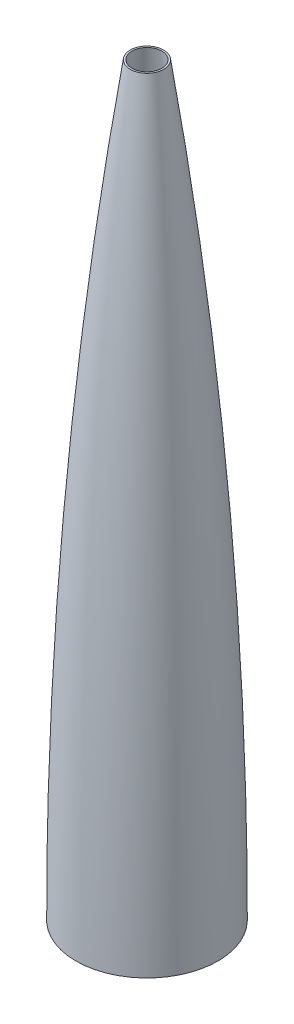
ISO-10303-21;
HEADER;
FILE_DESCRIPTION(('STEP AP214'),'2;1');
FILE_NAME('part.step','',(''),(''),'','','');
FILE_SCHEMA(('AUTOMOTIVE_DESIGN { 1 0 10303 214 1 1 1 1 }'));
ENDSEC;
DATA;
#1=APPLICATION_CONTEXT('core data for automotive mechanical design processes');
#2=APPLICATION_PROTOCOL_DEFINITION('international standard','automotive_design',2000,#1);
#3=PRODUCT_CONTEXT('',#1,'mechanical');
#4=PRODUCT('Part','Part','',(#3));
#5=PRODUCT_RELATED_PRODUCT_CATEGORY('part','',(#4));
#6=PRODUCT_DEFINITION_FORMATION('','',#4);
#7=PRODUCT_DEFINITION_CONTEXT('part definition',#1,'design');
#8=PRODUCT_DEFINITION('design','',#6,#7);
#9=PRODUCT_DEFINITION_SHAPE('','',#8);
#10=(LENGTH_UNIT() NAMED_UNIT(*) SI_UNIT(.MILLI.,.METRE.));
#11=(NAMED_UNIT(*) PLANE_ANGLE_UNIT() SI_UNIT($,.RADIAN.));
#12=(NAMED_UNIT(*) SI_UNIT($,.STERADIAN.) SOLID_ANGLE_UNIT());
#13=UNCERTAINTY_MEASURE_WITH_UNIT(LENGTH_MEASURE(1.E-05),#10,'distance_accuracy_value','');
#14=(GEOMETRIC_REPRESENTATION_CONTEXT(3) GLOBAL_UNCERTAINTY_ASSIGNED_CONTEXT((#13)) GLOBAL_UNIT_ASSIGNED_CONTEXT((#10,
#11,#12)) REPRESENTATION_CONTEXT('',''));
#15=CARTESIAN_POINT('',(0.,0.,0.));
#16=DIRECTION('',(0.,0.,1.));
#17=DIRECTION('',(1.,0.,0.));
#18=AXIS2_PLACEMENT_3D('',#15,#16,#17);
#19=CARTESIAN_POINT('',(0.,0.,0.));
#20=DIRECTION('',(0.,1.,0.));
#21=DIRECTION('',(0.,0.,1.));
#22=AXIS2_PLACEMENT_3D('',#19,#20,#21);
#23=DEGENERATE_TOROIDAL_SURFACE('',#22,3632.19999999999,3681.72999999999,.F.);
#24=CARTESIAN_POINT('',(0.,533.4,0.));
#25=DIRECTION('',(0.,1.,0.));
#26=DIRECTION('',(0.,0.,1.));
#27=AXIS2_PLACEMENT_3D('',#24,#25,#26);
#28=CIRCLE('',#27,10.6862503377726);
#29=CARTESIAN_POINT('',(0.,533.4,10.6862503377726));
#30=VERTEX_POINT('',#29);
#31=EDGE_CURVE('E10',#30,#30,#28,.T.);
#32=ORIENTED_EDGE('',*,*,#31,.T.);
#33=EDGE_LOOP('',(#32));
#34=FACE_BOUND('',#33,.T.);
#35=CARTESIAN_POINT('',(0.,0.,0.));
#36=DIRECTION('',(0.,1.,0.));
#37=DIRECTION('',(0.,0.,1.));
#38=AXIS2_PLACEMENT_3D('',#35,#36,#37);
#39=CIRCLE('',#38,49.53);
#40=CARTESIAN_POINT('',(0.,0.,49.53));
#41=VERTEX_POINT('',#40);
#42=EDGE_CURVE('E45',#41,#41,#39,.T.);
#43=ORIENTED_EDGE('',*,*,#42,.F.);
#44=EDGE_LOOP('',(#43));
#45=FACE_BOUND('',#44,.T.);
#46=ADVANCED_FACE('F31',(#34,#45),#23,.T.);
#47=CARTESIAN_POINT('',(-10.6862503377726,533.4,0.));
#48=DIRECTION('',(0.,1.,0.));
#49=DIRECTION('',(0.,0.,1.));
#50=AXIS2_PLACEMENT_3D('',#47,#48,#49);
#51=PLANE('',#50);
#52=CARTESIAN_POINT('',(0.,533.4,0.));
#53=DIRECTION('',(0.,1.,0.));
#54=DIRECTION('',(0.,0.,1.));
#55=AXIS2_PLACEMENT_3D('',#52,#53,#54);
#56=CIRCLE('',#55,11.9697874824656);
#57=CARTESIAN_POINT('',(0.,533.4,11.9697874824656));
#58=VERTEX_POINT('',#57);
#59=EDGE_CURVE('E37',#58,#58,#56,.T.);
#60=ORIENTED_EDGE('',*,*,#59,.T.);
#61=EDGE_LOOP('',(#60));
#62=FACE_BOUND('',#61,.T.);
#63=ORIENTED_EDGE('',*,*,#31,.F.);
#64=EDGE_LOOP('',(#63));
#65=FACE_BOUND('',#64,.T.);
#66=ADVANCED_FACE('F55',(#62,#65),#51,.T.);
#67=CARTESIAN_POINT('',(0.,0.,0.));
#68=DIRECTION('',(0.,1.,0.));
#69=DIRECTION('',(0.,0.,1.));
#70=AXIS2_PLACEMENT_3D('',#67,#68,#69);
#71=DEGENERATE_TOROIDAL_SURFACE('',#70,3632.19999999999,3682.99999999999,.F.);
#72=CARTESIAN_POINT('',(0.,0.,0.));
#73=DIRECTION('',(0.,1.,0.));
#74=DIRECTION('',(0.,0.,1.));
#75=AXIS2_PLACEMENT_3D('',#72,#73,#74);
#76=CIRCLE('',#75,50.8);
#77=CARTESIAN_POINT('',(0.,0.,50.8));
#78=VERTEX_POINT('',#77);
#79=EDGE_CURVE('E41',#78,#78,#76,.T.);
#80=ORIENTED_EDGE('',*,*,#79,.T.);
#81=EDGE_LOOP('',(#80));
#82=FACE_BOUND('',#81,.T.);
#83=ORIENTED_EDGE('',*,*,#59,.F.);
#84=EDGE_LOOP('',(#83));
#85=FACE_BOUND('',#84,.T.);
#86=ADVANCED_FACE('F59',(#82,#85),#71,.F.);
#87=CARTESIAN_POINT('',(-49.53,0.,0.));
#88=DIRECTION('',(0.,-1.,0.));
#89=DIRECTION('',(0.,0.,-1.));
#90=AXIS2_PLACEMENT_3D('',#87,#88,#89);
#91=PLANE('',#90);
#92=ORIENTED_EDGE('',*,*,#42,.T.);
#93=EDGE_LOOP('',(#92));
#94=FACE_BOUND('',#93,.T.);
#95=ORIENTED_EDGE('',*,*,#79,.F.);
#96=EDGE_LOOP('',(#95));
#97=FACE_BOUND('',#96,.T.);
#98=ADVANCED_FACE('F51',(#94,#97),#91,.T.);
#99=CLOSED_SHELL('',(#46,#66,#86,#98));
#100=MANIFOLD_SOLID_BREP('B2',#99);
#101=ADVANCED_BREP_SHAPE_REPRESENTATION('',(#18,#100),#14);
#102=SHAPE_DEFINITION_REPRESENTATION(#9,#101);
ENDSEC;
END-ISO-10303-21;
